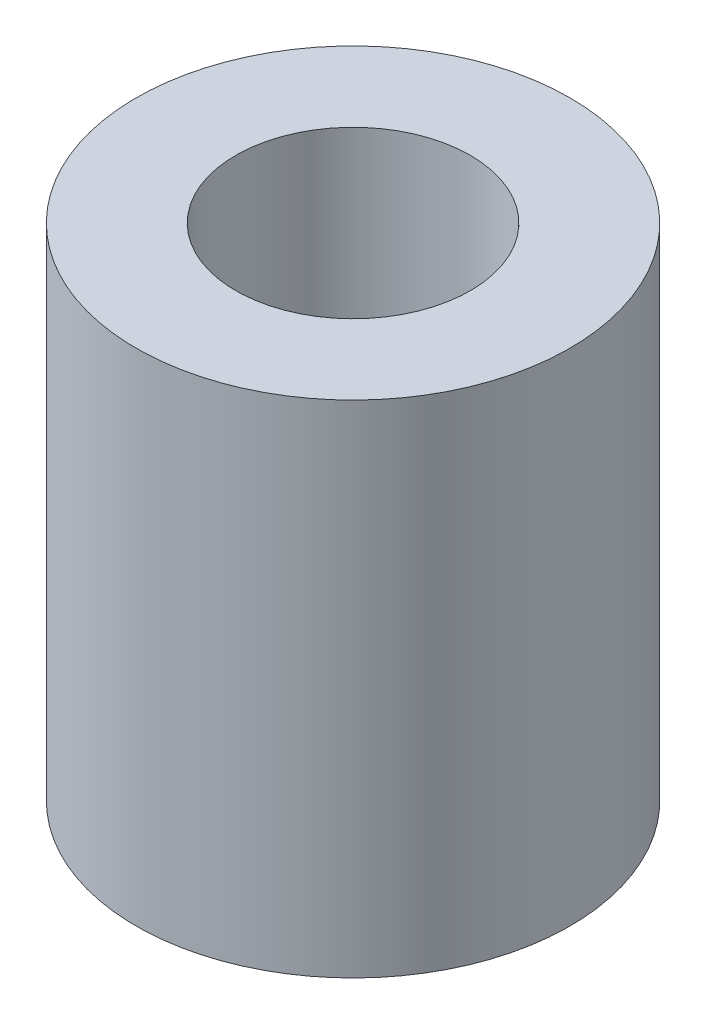
ISO-10303-21;
HEADER;
FILE_DESCRIPTION(('STEP AP214'),'2;1');
FILE_NAME('part.step','',(''),(''),'','','');
FILE_SCHEMA(('AUTOMOTIVE_DESIGN { 1 0 10303 214 1 1 1 1 }'));
ENDSEC;
DATA;
#1=APPLICATION_CONTEXT('core data for automotive mechanical design processes');
#2=APPLICATION_PROTOCOL_DEFINITION('international standard','automotive_design',2000,#1);
#3=PRODUCT_CONTEXT('',#1,'mechanical');
#4=PRODUCT('Part','Part','',(#3));
#5=PRODUCT_RELATED_PRODUCT_CATEGORY('part','',(#4));
#6=PRODUCT_DEFINITION_FORMATION('','',#4);
#7=PRODUCT_DEFINITION_CONTEXT('part definition',#1,'design');
#8=PRODUCT_DEFINITION('design','',#6,#7);
#9=PRODUCT_DEFINITION_SHAPE('','',#8);
#10=(LENGTH_UNIT() NAMED_UNIT(*) SI_UNIT(.MILLI.,.METRE.));
#11=(NAMED_UNIT(*) PLANE_ANGLE_UNIT() SI_UNIT($,.RADIAN.));
#12=(NAMED_UNIT(*) SI_UNIT($,.STERADIAN.) SOLID_ANGLE_UNIT());
#13=UNCERTAINTY_MEASURE_WITH_UNIT(LENGTH_MEASURE(1.E-05),#10,'distance_accuracy_value','');
#14=(GEOMETRIC_REPRESENTATION_CONTEXT(3) GLOBAL_UNCERTAINTY_ASSIGNED_CONTEXT((#13)) GLOBAL_UNIT_ASSIGNED_CONTEXT((#10,
#11,#12)) REPRESENTATION_CONTEXT('',''));
#15=CARTESIAN_POINT('',(0.,0.,0.));
#16=DIRECTION('',(0.,0.,1.));
#17=DIRECTION('',(1.,0.,0.));
#18=AXIS2_PLACEMENT_3D('',#15,#16,#17);
#19=CARTESIAN_POINT('',(0.,0.,0.));
#20=DIRECTION('',(0.,1.,0.));
#21=DIRECTION('',(0.,0.,1.));
#22=AXIS2_PLACEMENT_3D('',#19,#20,#21);
#23=PLANE('',#22);
#24=CARTESIAN_POINT('',(0.,0.,0.));
#25=DIRECTION('',(0.,-1.,0.));
#26=DIRECTION('',(0.,0.,-1.));
#27=AXIS2_PLACEMENT_3D('',#24,#25,#26);
#28=CIRCLE('',#27,7.366);
#29=CARTESIAN_POINT('',(0.,0.,-7.366));
#30=VERTEX_POINT('',#29);
#31=EDGE_CURVE('E63',#30,#30,#28,.T.);
#32=ORIENTED_EDGE('',*,*,#31,.F.);
#33=EDGE_LOOP('',(#32));
#34=FACE_BOUND('',#33,.T.);
#35=CARTESIAN_POINT('',(0.,0.,0.));
#36=DIRECTION('',(0.,-1.,0.));
#37=DIRECTION('',(0.,0.,-1.));
#38=AXIS2_PLACEMENT_3D('',#35,#36,#37);
#39=CIRCLE('',#38,16.51);
#40=CARTESIAN_POINT('',(0.,0.,-16.51));
#41=VERTEX_POINT('',#40);
#42=EDGE_CURVE('E10',#41,#41,#39,.T.);
#43=ORIENTED_EDGE('',*,*,#42,.T.);
#44=EDGE_LOOP('',(#43));
#45=FACE_BOUND('',#44,.T.);
#46=ADVANCED_FACE('F35',(#34,#45),#23,.F.);
#47=CARTESIAN_POINT('',(0.,0.,0.));
#48=DIRECTION('',(0.,-1.,0.));
#49=DIRECTION('',(0.,0.,-1.));
#50=AXIS2_PLACEMENT_3D('',#47,#48,#49);
#51=CYLINDRICAL_SURFACE('',#50,16.51);
#52=ORIENTED_EDGE('',*,*,#42,.F.);
#53=EDGE_LOOP('',(#52));
#54=FACE_BOUND('',#53,.T.);
#55=CARTESIAN_POINT('',(0.,38.1,0.));
#56=DIRECTION('',(0.,-1.,0.));
#57=DIRECTION('',(0.,0.,-1.));
#58=AXIS2_PLACEMENT_3D('',#55,#56,#57);
#59=CIRCLE('',#58,16.51);
#60=CARTESIAN_POINT('',(0.,38.1,-16.51));
#61=VERTEX_POINT('',#60);
#62=EDGE_CURVE('E41',#61,#61,#59,.T.);
#63=ORIENTED_EDGE('',*,*,#62,.T.);
#64=EDGE_LOOP('',(#63));
#65=FACE_BOUND('',#64,.T.);
#66=ADVANCED_FACE('F71',(#54,#65),#51,.T.);
#67=CARTESIAN_POINT('',(0.,38.1,16.51));
#68=DIRECTION('',(0.,-1.,0.));
#69=DIRECTION('',(0.,0.,-1.));
#70=AXIS2_PLACEMENT_3D('',#67,#68,#69);
#71=PLANE('',#70);
#72=ORIENTED_EDGE('',*,*,#62,.F.);
#73=EDGE_LOOP('',(#72));
#74=FACE_BOUND('',#73,.T.);
#75=CARTESIAN_POINT('',(0.,38.1,0.));
#76=DIRECTION('',(0.,-1.,0.));
#77=DIRECTION('',(0.,0.,-1.));
#78=AXIS2_PLACEMENT_3D('',#75,#76,#77);
#79=CIRCLE('',#78,8.9281);
#80=CARTESIAN_POINT('',(0.,38.1,-8.9281));
#81=VERTEX_POINT('',#80);
#82=EDGE_CURVE('E45',#81,#81,#79,.T.);
#83=ORIENTED_EDGE('',*,*,#82,.T.);
#84=EDGE_LOOP('',(#83));
#85=FACE_BOUND('',#84,.T.);
#86=ADVANCED_FACE('F75',(#74,#85),#71,.F.);
#87=CARTESIAN_POINT('',(0.,0.,0.));
#88=DIRECTION('',(0.,-1.,0.));
#89=DIRECTION('',(0.,0.,-1.));
#90=AXIS2_PLACEMENT_3D('',#87,#88,#89);
#91=CYLINDRICAL_SURFACE('',#90,8.9281);
#92=ORIENTED_EDGE('',*,*,#82,.F.);
#93=EDGE_LOOP('',(#92));
#94=FACE_BOUND('',#93,.T.);
#95=CARTESIAN_POINT('',(0.,20.32,0.));
#96=DIRECTION('',(0.,-1.,0.));
#97=DIRECTION('',(0.,0.,-1.));
#98=AXIS2_PLACEMENT_3D('',#95,#96,#97);
#99=CIRCLE('',#98,8.9281);
#100=CARTESIAN_POINT('',(0.,20.32,-8.9281));
#101=VERTEX_POINT('',#100);
#102=EDGE_CURVE('E49',#101,#101,#99,.T.);
#103=ORIENTED_EDGE('',*,*,#102,.T.);
#104=EDGE_LOOP('',(#103));
#105=FACE_BOUND('',#104,.T.);
#106=ADVANCED_FACE('F80',(#94,#105),#91,.F.);
#107=CARTESIAN_POINT('',(0.,20.32,8.9281));
#108=DIRECTION('',(0.,1.,0.));
#109=DIRECTION('',(0.,0.,1.));
#110=AXIS2_PLACEMENT_3D('',#107,#108,#109);
#111=PLANE('',#110);
#112=ORIENTED_EDGE('',*,*,#102,.F.);
#113=EDGE_LOOP('',(#112));
#114=FACE_BOUND('',#113,.T.);
#115=CARTESIAN_POINT('',(0.,20.32,0.));
#116=DIRECTION('',(0.,-1.,0.));
#117=DIRECTION('',(0.,0.,-1.));
#118=AXIS2_PLACEMENT_3D('',#115,#116,#117);
#119=CIRCLE('',#118,10.795);
#120=CARTESIAN_POINT('',(0.,20.32,-10.795));
#121=VERTEX_POINT('',#120);
#122=EDGE_CURVE('E54',#121,#121,#119,.T.);
#123=ORIENTED_EDGE('',*,*,#122,.T.);
#124=EDGE_LOOP('',(#123));
#125=FACE_BOUND('',#124,.T.);
#126=ADVANCED_FACE('F86',(#114,#125),#111,.F.);
#127=CARTESIAN_POINT('',(0.,0.,0.));
#128=DIRECTION('',(0.,-1.,0.));
#129=DIRECTION('',(0.,0.,-1.));
#130=AXIS2_PLACEMENT_3D('',#127,#128,#129);
#131=CYLINDRICAL_SURFACE('',#130,10.795);
#132=ORIENTED_EDGE('',*,*,#122,.F.);
#133=EDGE_LOOP('',(#132));
#134=FACE_BOUND('',#133,.T.);
#135=CARTESIAN_POINT('',(0.,2.54,0.));
#136=DIRECTION('',(0.,-1.,0.));
#137=DIRECTION('',(0.,0.,-1.));
#138=AXIS2_PLACEMENT_3D('',#135,#136,#137);
#139=CIRCLE('',#138,10.795);
#140=CARTESIAN_POINT('',(0.,2.54,-10.795));
#141=VERTEX_POINT('',#140);
#142=EDGE_CURVE('E57',#141,#141,#139,.T.);
#143=ORIENTED_EDGE('',*,*,#142,.T.);
#144=EDGE_LOOP('',(#143));
#145=FACE_BOUND('',#144,.T.);
#146=ADVANCED_FACE('F90',(#134,#145),#131,.F.);
#147=CARTESIAN_POINT('',(0.,2.54,8.92809999999999));
#148=DIRECTION('',(0.,-1.,0.));
#149=DIRECTION('',(0.,0.,-1.));
#150=AXIS2_PLACEMENT_3D('',#147,#148,#149);
#151=PLANE('',#150);
#152=CARTESIAN_POINT('',(0.,2.54,0.));
#153=DIRECTION('',(0.,-1.,0.));
#154=DIRECTION('',(0.,0.,-1.));
#155=AXIS2_PLACEMENT_3D('',#152,#153,#154);
#156=CIRCLE('',#155,7.366);
#157=CARTESIAN_POINT('',(0.,2.54,-7.366));
#158=VERTEX_POINT('',#157);
#159=EDGE_CURVE('E60',#158,#158,#156,.F.);
#160=ORIENTED_EDGE('',*,*,#159,.F.);
#161=EDGE_LOOP('',(#160));
#162=FACE_BOUND('',#161,.T.);
#163=ORIENTED_EDGE('',*,*,#142,.F.);
#164=EDGE_LOOP('',(#163));
#165=FACE_BOUND('',#164,.T.);
#166=ADVANCED_FACE('F94',(#162,#165),#151,.F.);
#167=CARTESIAN_POINT('',(0.,38.101,0.));
#168=DIRECTION('',(0.,-1.,0.));
#169=DIRECTION('',(0.,0.,-1.));
#170=AXIS2_PLACEMENT_3D('',#167,#168,#169);
#171=CYLINDRICAL_SURFACE('',#170,7.366);
#172=ORIENTED_EDGE('',*,*,#31,.T.);
#173=EDGE_LOOP('',(#172));
#174=FACE_BOUND('',#173,.T.);
#175=ORIENTED_EDGE('',*,*,#159,.T.);
#176=EDGE_LOOP('',(#175));
#177=FACE_BOUND('',#176,.T.);
#178=ADVANCED_FACE('F67',(#174,#177),#171,.F.);
#179=CLOSED_SHELL('',(#46,#66,#86,#106,#126,#146,#166,#178));
#180=MANIFOLD_SOLID_BREP('B2',#179);
#181=ADVANCED_BREP_SHAPE_REPRESENTATION('',(#18,#180),#14);
#182=SHAPE_DEFINITION_REPRESENTATION(#9,#181);
ENDSEC;
END-ISO-10303-21;
